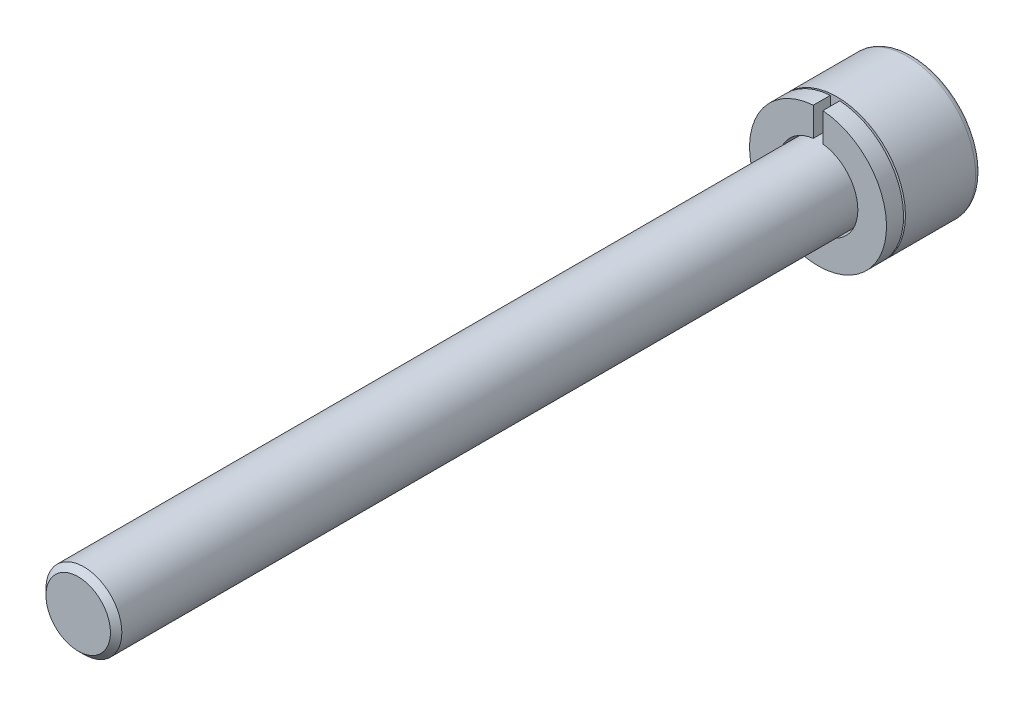
ISO-10303-21;
HEADER;
FILE_DESCRIPTION(('STEP AP214'),'2;1');
FILE_NAME('part.step','',(''),(''),'','','');
FILE_SCHEMA(('AUTOMOTIVE_DESIGN { 1 0 10303 214 1 1 1 1 }'));
ENDSEC;
DATA;
#1=APPLICATION_CONTEXT('core data for automotive mechanical design processes');
#2=APPLICATION_PROTOCOL_DEFINITION('international standard','automotive_design',2000,#1);
#3=PRODUCT_CONTEXT('',#1,'mechanical');
#4=PRODUCT('Part','Part','',(#3));
#5=PRODUCT_RELATED_PRODUCT_CATEGORY('part','',(#4));
#6=PRODUCT_DEFINITION_FORMATION('','',#4);
#7=PRODUCT_DEFINITION_CONTEXT('part definition',#1,'design');
#8=PRODUCT_DEFINITION('design','',#6,#7);
#9=PRODUCT_DEFINITION_SHAPE('','',#8);
#10=(LENGTH_UNIT() NAMED_UNIT(*) SI_UNIT(.MILLI.,.METRE.));
#11=(NAMED_UNIT(*) PLANE_ANGLE_UNIT() SI_UNIT($,.RADIAN.));
#12=(NAMED_UNIT(*) SI_UNIT($,.STERADIAN.) SOLID_ANGLE_UNIT());
#13=UNCERTAINTY_MEASURE_WITH_UNIT(LENGTH_MEASURE(1.E-05),#10,'distance_accuracy_value','');
#14=(GEOMETRIC_REPRESENTATION_CONTEXT(3) GLOBAL_UNCERTAINTY_ASSIGNED_CONTEXT((#13)) GLOBAL_UNIT_ASSIGNED_CONTEXT((#10,
#11,#12)) REPRESENTATION_CONTEXT('',''));
#15=CARTESIAN_POINT('',(0.,0.,0.));
#16=DIRECTION('',(0.,0.,1.));
#17=DIRECTION('',(1.,0.,0.));
#18=AXIS2_PLACEMENT_3D('',#15,#16,#17);
#19=CARTESIAN_POINT('',(0.,0.,4.));
#20=DIRECTION('',(0.,0.,1.));
#21=DIRECTION('',(1.,0.,0.));
#22=AXIS2_PLACEMENT_3D('',#19,#20,#21);
#23=PLANE('',#22);
#24=CARTESIAN_POINT('',(0.,0.,4.));
#25=DIRECTION('',(0.,0.,1.));
#26=DIRECTION('',(1.,0.,0.));
#27=AXIS2_PLACEMENT_3D('',#24,#25,#26);
#28=CIRCLE('',#27,3.61);
#29=CARTESIAN_POINT('',(3.61,0.,4.));
#30=VERTEX_POINT('',#29);
#31=EDGE_CURVE('P0_E126',#30,#30,#28,.T.);
#32=ORIENTED_EDGE('',*,*,#31,.T.);
#33=EDGE_LOOP('',(#32));
#34=FACE_BOUND('',#33,.T.);
#35=CARTESIAN_POINT('',(0.,0.,4.));
#36=DIRECTION('',(0.,0.,1.));
#37=DIRECTION('',(1.,0.,0.));
#38=AXIS2_PLACEMENT_3D('',#35,#36,#37);
#39=CIRCLE('',#38,2.);
#40=CARTESIAN_POINT('',(2.,0.,4.));
#41=VERTEX_POINT('',#40);
#42=EDGE_CURVE('P0_E118',#41,#41,#39,.T.);
#43=ORIENTED_EDGE('',*,*,#42,.F.);
#44=EDGE_LOOP('',(#43));
#45=FACE_BOUND('',#44,.T.);
#46=ADVANCED_FACE('P0_F17',(#34,#45),#23,.T.);
#47=CARTESIAN_POINT('',(0.,0.,4.));
#48=DIRECTION('',(0.,0.,-1.));
#49=DIRECTION('',(-1.,0.,0.));
#50=AXIS2_PLACEMENT_3D('',#47,#48,#49);
#51=CYLINDRICAL_SURFACE('',#50,3.61);
#52=CARTESIAN_POINT('',(0.,0.,0.3));
#53=DIRECTION('',(0.,0.,1.));
#54=DIRECTION('',(1.,0.,0.));
#55=AXIS2_PLACEMENT_3D('',#52,#53,#54);
#56=CIRCLE('',#55,3.61);
#57=CARTESIAN_POINT('',(3.61,0.,0.3));
#58=VERTEX_POINT('',#57);
#59=EDGE_CURVE('P0_E25',#58,#58,#56,.T.);
#60=ORIENTED_EDGE('',*,*,#59,.T.);
#61=EDGE_LOOP('',(#60));
#62=FACE_BOUND('',#61,.T.);
#63=ORIENTED_EDGE('',*,*,#31,.F.);
#64=EDGE_LOOP('',(#63));
#65=FACE_BOUND('',#64,.T.);
#66=ADVANCED_FACE('P0_F139',(#62,#65),#51,.T.);
#67=CARTESIAN_POINT('',(0.,0.,0.));
#68=DIRECTION('',(0.,0.,1.));
#69=DIRECTION('',(1.,0.,0.));
#70=AXIS2_PLACEMENT_3D('',#67,#68,#69);
#71=PLANE('',#70);
#72=CARTESIAN_POINT('',(0.,0.,0.));
#73=DIRECTION('',(0.,0.,1.));
#74=DIRECTION('',(1.,0.,0.));
#75=AXIS2_PLACEMENT_3D('',#72,#73,#74);
#76=CIRCLE('',#75,3.31);
#77=CARTESIAN_POINT('',(3.31,0.,0.));
#78=VERTEX_POINT('',#77);
#79=EDGE_CURVE('P0_E11',#78,#78,#76,.F.);
#80=ORIENTED_EDGE('',*,*,#79,.T.);
#81=EDGE_LOOP('',(#80));
#82=FACE_BOUND('',#81,.T.);
#83=DIRECTION('',(0.866025403784439,-0.5,0.));
#84=VECTOR('',#83,1.);
#85=CARTESIAN_POINT('',(0.,1.5,0.));
#86=LINE('',#85,#84);
#87=CARTESIAN_POINT('',(0.,1.5,0.));
#88=VERTEX_POINT('',#87);
#89=CARTESIAN_POINT('',(1.29903810567666,0.75,0.));
#90=VERTEX_POINT('',#89);
#91=EDGE_CURVE('P0_E106',#88,#90,#86,.T.);
#92=ORIENTED_EDGE('',*,*,#91,.F.);
#93=DIRECTION('',(0.866025403784439,0.5,0.));
#94=VECTOR('',#93,1.);
#95=CARTESIAN_POINT('',(-1.29903810567666,0.75,0.));
#96=LINE('',#95,#94);
#97=CARTESIAN_POINT('',(-1.29903810567666,0.75,0.));
#98=VERTEX_POINT('',#97);
#99=EDGE_CURVE('P0_E32',#98,#88,#96,.T.);
#100=ORIENTED_EDGE('',*,*,#99,.F.);
#101=DIRECTION('',(0.,1.,0.));
#102=VECTOR('',#101,1.);
#103=CARTESIAN_POINT('',(-1.29903810567666,-0.75,0.));
#104=LINE('',#103,#102);
#105=CARTESIAN_POINT('',(-1.29903810567666,-0.75,0.));
#106=VERTEX_POINT('',#105);
#107=EDGE_CURVE('P0_E113',#106,#98,#104,.T.);
#108=ORIENTED_EDGE('',*,*,#107,.F.);
#109=DIRECTION('',(-0.866025403784439,0.5,0.));
#110=VECTOR('',#109,1.);
#111=CARTESIAN_POINT('',(0.,-1.5,0.));
#112=LINE('',#111,#110);
#113=CARTESIAN_POINT('',(0.,-1.5,0.));
#114=VERTEX_POINT('',#113);
#115=EDGE_CURVE('P0_E114',#114,#106,#112,.T.);
#116=ORIENTED_EDGE('',*,*,#115,.F.);
#117=DIRECTION('',(-0.866025403784439,-0.5,0.));
#118=VECTOR('',#117,1.);
#119=CARTESIAN_POINT('',(1.29903810567666,-0.75,0.));
#120=LINE('',#119,#118);
#121=CARTESIAN_POINT('',(1.29903810567666,-0.75,0.));
#122=VERTEX_POINT('',#121);
#123=EDGE_CURVE('P0_E79',#122,#114,#120,.T.);
#124=ORIENTED_EDGE('',*,*,#123,.F.);
#125=DIRECTION('',(0.,-1.,0.));
#126=VECTOR('',#125,1.);
#127=CARTESIAN_POINT('',(1.29903810567666,0.75,0.));
#128=LINE('',#127,#126);
#129=EDGE_CURVE('P0_E108',#90,#122,#128,.T.);
#130=ORIENTED_EDGE('',*,*,#129,.F.);
#131=EDGE_LOOP('',(#92,#100,#108,#116,#124,#130));
#132=FACE_BOUND('',#131,.T.);
#133=ADVANCED_FACE('P0_F158',(#82,#132),#71,.F.);
#134=CARTESIAN_POINT('',(0.,0.,44.));
#135=DIRECTION('',(0.,0.,-1.));
#136=DIRECTION('',(-1.,0.,0.));
#137=AXIS2_PLACEMENT_3D('',#134,#135,#136);
#138=CYLINDRICAL_SURFACE('',#137,2.);
#139=CARTESIAN_POINT('',(0.,0.,43.7));
#140=DIRECTION('',(0.,0.,1.));
#141=DIRECTION('',(1.,0.,0.));
#142=AXIS2_PLACEMENT_3D('',#139,#140,#141);
#143=CIRCLE('',#142,2.);
#144=CARTESIAN_POINT('',(2.,0.,43.7));
#145=VERTEX_POINT('',#144);
#146=EDGE_CURVE('P0_E132',#145,#145,#143,.F.);
#147=ORIENTED_EDGE('',*,*,#146,.T.);
#148=EDGE_LOOP('',(#147));
#149=FACE_BOUND('',#148,.T.);
#150=ORIENTED_EDGE('',*,*,#42,.T.);
#151=EDGE_LOOP('',(#150));
#152=FACE_BOUND('',#151,.T.);
#153=ADVANCED_FACE('P0_F162',(#149,#152),#138,.T.);
#154=CARTESIAN_POINT('',(0.,0.,44.));
#155=DIRECTION('',(0.,0.,1.));
#156=DIRECTION('',(1.,0.,0.));
#157=AXIS2_PLACEMENT_3D('',#154,#155,#156);
#158=PLANE('',#157);
#159=CARTESIAN_POINT('',(0.,0.,44.));
#160=DIRECTION('',(0.,0.,1.));
#161=DIRECTION('',(1.,0.,0.));
#162=AXIS2_PLACEMENT_3D('',#159,#160,#161);
#163=CIRCLE('',#162,1.7);
#164=CARTESIAN_POINT('',(1.7,0.,44.));
#165=VERTEX_POINT('',#164);
#166=EDGE_CURVE('P0_E129',#165,#165,#163,.T.);
#167=ORIENTED_EDGE('',*,*,#166,.T.);
#168=EDGE_LOOP('',(#167));
#169=FACE_BOUND('',#168,.T.);
#170=ADVANCED_FACE('P0_F168',(#169),#158,.T.);
#171=CARTESIAN_POINT('',(0.,0.,44.));
#172=DIRECTION('',(0.,0.,-1.));
#173=DIRECTION('',(-1.,0.,0.));
#174=AXIS2_PLACEMENT_3D('',#171,#172,#173);
#175=CONICAL_SURFACE('',#174,1.7,0.785398163397446);
#176=ORIENTED_EDGE('',*,*,#146,.F.);
#177=EDGE_LOOP('',(#176));
#178=FACE_BOUND('',#177,.T.);
#179=ORIENTED_EDGE('',*,*,#166,.F.);
#180=EDGE_LOOP('',(#179));
#181=FACE_BOUND('',#180,.T.);
#182=ADVANCED_FACE('P0_F170',(#178,#181),#175,.T.);
#183=CARTESIAN_POINT('',(-1.29903810567666,0.75,1.8));
#184=DIRECTION('',(-0.5,0.866025403784439,0.));
#185=DIRECTION('',(-0.866025403784439,-0.5,0.));
#186=AXIS2_PLACEMENT_3D('',#183,#184,#185);
#187=PLANE('',#186);
#188=ORIENTED_EDGE('',*,*,#99,.T.);
#189=DIRECTION('',(0.,0.,-1.));
#190=VECTOR('',#189,1.);
#191=CARTESIAN_POINT('',(0.,1.5,1.8));
#192=LINE('',#191,#190);
#193=CARTESIAN_POINT('',(0.,1.5,1.8));
#194=VERTEX_POINT('',#193);
#195=EDGE_CURVE('P0_E62',#194,#88,#192,.T.);
#196=ORIENTED_EDGE('',*,*,#195,.F.);
#197=DIRECTION('',(0.866025403784439,0.5,0.));
#198=VECTOR('',#197,1.);
#199=CARTESIAN_POINT('',(-1.29903810567666,0.75,1.8));
#200=LINE('',#199,#198);
#201=CARTESIAN_POINT('',(-1.29903810567666,0.75,1.8));
#202=VERTEX_POINT('',#201);
#203=EDGE_CURVE('P0_E117',#202,#194,#200,.T.);
#204=ORIENTED_EDGE('',*,*,#203,.F.);
#205=DIRECTION('',(0.,0.,-1.));
#206=VECTOR('',#205,1.);
#207=CARTESIAN_POINT('',(-1.29903810567666,0.75,1.8));
#208=LINE('',#207,#206);
#209=EDGE_CURVE('P0_E37',#202,#98,#208,.T.);
#210=ORIENTED_EDGE('',*,*,#209,.T.);
#211=EDGE_LOOP('',(#188,#196,#204,#210));
#212=FACE_BOUND('',#211,.T.);
#213=ADVANCED_FACE('P0_F166',(#212),#187,.F.);
#214=CARTESIAN_POINT('',(-1.29903810567666,-0.75,1.8));
#215=DIRECTION('',(-1.,0.,0.));
#216=DIRECTION('',(0.,-1.,0.));
#217=AXIS2_PLACEMENT_3D('',#214,#215,#216);
#218=PLANE('',#217);
#219=ORIENTED_EDGE('',*,*,#107,.T.);
#220=ORIENTED_EDGE('',*,*,#209,.F.);
#221=DIRECTION('',(0.,1.,0.));
#222=VECTOR('',#221,1.);
#223=CARTESIAN_POINT('',(-1.29903810567666,-0.75,1.8));
#224=LINE('',#223,#222);
#225=CARTESIAN_POINT('',(-1.29903810567666,-0.75,1.8));
#226=VERTEX_POINT('',#225);
#227=EDGE_CURVE('P0_E95',#226,#202,#224,.T.);
#228=ORIENTED_EDGE('',*,*,#227,.F.);
#229=DIRECTION('',(0.,0.,-1.));
#230=VECTOR('',#229,1.);
#231=CARTESIAN_POINT('',(-1.29903810567666,-0.75,1.8));
#232=LINE('',#231,#230);
#233=EDGE_CURVE('P0_E81',#226,#106,#232,.T.);
#234=ORIENTED_EDGE('',*,*,#233,.T.);
#235=EDGE_LOOP('',(#219,#220,#228,#234));
#236=FACE_BOUND('',#235,.T.);
#237=ADVANCED_FACE('P0_F179',(#236),#218,.F.);
#238=CARTESIAN_POINT('',(0.,-1.5,1.8));
#239=DIRECTION('',(-0.5,-0.866025403784439,0.));
#240=DIRECTION('',(0.866025403784439,-0.5,0.));
#241=AXIS2_PLACEMENT_3D('',#238,#239,#240);
#242=PLANE('',#241);
#243=ORIENTED_EDGE('',*,*,#115,.T.);
#244=ORIENTED_EDGE('',*,*,#233,.F.);
#245=DIRECTION('',(-0.866025403784439,0.5,0.));
#246=VECTOR('',#245,1.);
#247=CARTESIAN_POINT('',(0.,-1.5,1.8));
#248=LINE('',#247,#246);
#249=CARTESIAN_POINT('',(0.,-1.5,1.8));
#250=VERTEX_POINT('',#249);
#251=EDGE_CURVE('P0_E86',#250,#226,#248,.T.);
#252=ORIENTED_EDGE('',*,*,#251,.F.);
#253=DIRECTION('',(0.,0.,-1.));
#254=VECTOR('',#253,1.);
#255=CARTESIAN_POINT('',(0.,-1.5,1.8));
#256=LINE('',#255,#254);
#257=EDGE_CURVE('P0_E73',#250,#114,#256,.T.);
#258=ORIENTED_EDGE('',*,*,#257,.T.);
#259=EDGE_LOOP('',(#243,#244,#252,#258));
#260=FACE_BOUND('',#259,.T.);
#261=ADVANCED_FACE('P0_F90',(#260),#242,.F.);
#262=CARTESIAN_POINT('',(1.29903810567666,-0.75,1.8));
#263=DIRECTION('',(0.5,-0.866025403784439,0.));
#264=DIRECTION('',(0.866025403784439,0.5,0.));
#265=AXIS2_PLACEMENT_3D('',#262,#263,#264);
#266=PLANE('',#265);
#267=ORIENTED_EDGE('',*,*,#123,.T.);
#268=ORIENTED_EDGE('',*,*,#257,.F.);
#269=DIRECTION('',(-0.866025403784439,-0.5,0.));
#270=VECTOR('',#269,1.);
#271=CARTESIAN_POINT('',(1.29903810567666,-0.75,1.8));
#272=LINE('',#271,#270);
#273=CARTESIAN_POINT('',(1.29903810567666,-0.75,1.8));
#274=VERTEX_POINT('',#273);
#275=EDGE_CURVE('P0_E80',#274,#250,#272,.T.);
#276=ORIENTED_EDGE('',*,*,#275,.F.);
#277=DIRECTION('',(0.,0.,-1.));
#278=VECTOR('',#277,1.);
#279=CARTESIAN_POINT('',(1.29903810567666,-0.75,1.8));
#280=LINE('',#279,#278);
#281=EDGE_CURVE('P0_E83',#274,#122,#280,.T.);
#282=ORIENTED_EDGE('',*,*,#281,.T.);
#283=EDGE_LOOP('',(#267,#268,#276,#282));
#284=FACE_BOUND('',#283,.T.);
#285=ADVANCED_FACE('P0_F74',(#284),#266,.F.);
#286=CARTESIAN_POINT('',(1.29903810567666,0.75,1.8));
#287=DIRECTION('',(1.,0.,0.));
#288=DIRECTION('',(0.,1.,0.));
#289=AXIS2_PLACEMENT_3D('',#286,#287,#288);
#290=PLANE('',#289);
#291=ORIENTED_EDGE('',*,*,#129,.T.);
#292=ORIENTED_EDGE('',*,*,#281,.F.);
#293=DIRECTION('',(0.,-1.,0.));
#294=VECTOR('',#293,1.);
#295=CARTESIAN_POINT('',(1.29903810567666,0.75,1.8));
#296=LINE('',#295,#294);
#297=CARTESIAN_POINT('',(1.29903810567666,0.75,1.8));
#298=VERTEX_POINT('',#297);
#299=EDGE_CURVE('P0_E98',#298,#274,#296,.T.);
#300=ORIENTED_EDGE('',*,*,#299,.F.);
#301=DIRECTION('',(0.,0.,-1.));
#302=VECTOR('',#301,1.);
#303=CARTESIAN_POINT('',(1.29903810567666,0.75,1.8));
#304=LINE('',#303,#302);
#305=EDGE_CURVE('P0_E124',#298,#90,#304,.T.);
#306=ORIENTED_EDGE('',*,*,#305,.T.);
#307=EDGE_LOOP('',(#291,#292,#300,#306));
#308=FACE_BOUND('',#307,.T.);
#309=ADVANCED_FACE('P0_F284',(#308),#290,.F.);
#310=CARTESIAN_POINT('',(0.,1.5,1.8));
#311=DIRECTION('',(0.5,0.866025403784439,0.));
#312=DIRECTION('',(-0.866025403784439,0.5,0.));
#313=AXIS2_PLACEMENT_3D('',#310,#311,#312);
#314=PLANE('',#313);
#315=ORIENTED_EDGE('',*,*,#91,.T.);
#316=ORIENTED_EDGE('',*,*,#305,.F.);
#317=DIRECTION('',(0.866025403784439,-0.5,0.));
#318=VECTOR('',#317,1.);
#319=CARTESIAN_POINT('',(0.,1.5,1.8));
#320=LINE('',#319,#318);
#321=EDGE_CURVE('P0_E99',#194,#298,#320,.T.);
#322=ORIENTED_EDGE('',*,*,#321,.F.);
#323=ORIENTED_EDGE('',*,*,#195,.T.);
#324=EDGE_LOOP('',(#315,#316,#322,#323));
#325=FACE_BOUND('',#324,.T.);
#326=ADVANCED_FACE('P0_F146',(#325),#314,.F.);
#327=CARTESIAN_POINT('',(0.,0.,1.8));
#328=DIRECTION('',(0.,0.,-1.));
#329=DIRECTION('',(-1.,0.,0.));
#330=AXIS2_PLACEMENT_3D('',#327,#328,#329);
#331=PLANE('',#330);
#332=ORIENTED_EDGE('',*,*,#203,.T.);
#333=ORIENTED_EDGE('',*,*,#321,.T.);
#334=ORIENTED_EDGE('',*,*,#299,.T.);
#335=ORIENTED_EDGE('',*,*,#275,.T.);
#336=ORIENTED_EDGE('',*,*,#251,.T.);
#337=ORIENTED_EDGE('',*,*,#227,.T.);
#338=EDGE_LOOP('',(#332,#333,#334,#335,#336,#337));
#339=FACE_BOUND('',#338,.T.);
#340=ADVANCED_FACE('P0_F92',(#339),#331,.T.);
#341=CARTESIAN_POINT('',(0.,0.,0.3));
#342=DIRECTION('',(0.,0.,1.));
#343=DIRECTION('',(1.,0.,0.));
#344=AXIS2_PLACEMENT_3D('',#341,#342,#343);
#345=TOROIDAL_SURFACE('',#344,3.31,0.3);
#346=ORIENTED_EDGE('',*,*,#79,.F.);
#347=EDGE_LOOP('',(#346));
#348=FACE_BOUND('',#347,.T.);
#349=ORIENTED_EDGE('',*,*,#59,.F.);
#350=EDGE_LOOP('',(#349));
#351=FACE_BOUND('',#350,.T.);
#352=ADVANCED_FACE('P0_F19',(#348,#351),#345,.T.);
#353=CLOSED_SHELL('',(#46,#66,#133,#153,#170,#182,#213,#237,#261,#285,#309,#326,#340,#352));
#354=MANIFOLD_SOLID_BREP('P0_B1',#353);
#355=CARTESIAN_POINT('',(0.,0.,5.));
#356=DIRECTION('',(0.,0.,1.));
#357=DIRECTION('',(1.,0.,0.));
#358=AXIS2_PLACEMENT_3D('',#355,#356,#357);
#359=PLANE('',#358);
#360=DIRECTION('',(0.,1.,0.));
#361=VECTOR('',#360,1.);
#362=CARTESIAN_POINT('',(0.25,5.1349340538007,5.));
#363=LINE('',#362,#361);
#364=CARTESIAN_POINT('',(0.25,2.0850659461993,5.));
#365=VERTEX_POINT('',#364);
#366=CARTESIAN_POINT('',(0.25,3.60133308651116,5.));
#367=VERTEX_POINT('',#366);
#368=EDGE_CURVE('P1_E71',#365,#367,#363,.T.);
#369=ORIENTED_EDGE('',*,*,#368,.F.);
#370=CARTESIAN_POINT('',(0.,0.,5.));
#371=DIRECTION('',(0.,0.,1.));
#372=DIRECTION('',(1.,0.,0.));
#373=AXIS2_PLACEMENT_3D('',#370,#371,#372);
#374=CIRCLE('',#373,2.1);
#375=CARTESIAN_POINT('',(-0.25,2.0850659461993,5.));
#376=VERTEX_POINT('',#375);
#377=EDGE_CURVE('P1_E72',#376,#365,#374,.T.);
#378=ORIENTED_EDGE('',*,*,#377,.F.);
#379=DIRECTION('',(0.,-1.,0.));
#380=VECTOR('',#379,1.);
#381=CARTESIAN_POINT('',(-0.25,5.1349340538007,5.));
#382=LINE('',#381,#380);
#383=CARTESIAN_POINT('',(-0.25,3.60133308651116,5.));
#384=VERTEX_POINT('',#383);
#385=EDGE_CURVE('P1_E83',#384,#376,#382,.T.);
#386=ORIENTED_EDGE('',*,*,#385,.F.);
#387=CARTESIAN_POINT('',(0.,0.,5.));
#388=DIRECTION('',(0.,0.,1.));
#389=DIRECTION('',(1.,0.,0.));
#390=AXIS2_PLACEMENT_3D('',#387,#388,#389);
#391=CIRCLE('',#390,3.61);
#392=EDGE_CURVE('P1_E25',#384,#367,#391,.T.);
#393=ORIENTED_EDGE('',*,*,#392,.T.);
#394=EDGE_LOOP('',(#369,#378,#386,#393));
#395=FACE_BOUND('',#394,.T.);
#396=ADVANCED_FACE('P1_F17',(#395),#359,.T.);
#397=CARTESIAN_POINT('',(0.,0.,5.));
#398=DIRECTION('',(0.,0.,-1.));
#399=DIRECTION('',(-1.,0.,0.));
#400=AXIS2_PLACEMENT_3D('',#397,#398,#399);
#401=CYLINDRICAL_SURFACE('',#400,3.61);
#402=DIRECTION('',(0.,0.,-1.));
#403=VECTOR('',#402,1.);
#404=CARTESIAN_POINT('',(-0.25,3.60133308651116,5.));
#405=LINE('',#404,#403);
#406=CARTESIAN_POINT('',(-0.25,3.60133308651116,4.1));
#407=VERTEX_POINT('',#406);
#408=EDGE_CURVE('P1_E70',#384,#407,#405,.T.);
#409=ORIENTED_EDGE('',*,*,#408,.T.);
#410=CARTESIAN_POINT('',(0.,0.,4.1));
#411=DIRECTION('',(0.,0.,1.));
#412=DIRECTION('',(1.,0.,0.));
#413=AXIS2_PLACEMENT_3D('',#410,#411,#412);
#414=CIRCLE('',#413,3.61);
#415=CARTESIAN_POINT('',(0.25,3.60133308651116,4.1));
#416=VERTEX_POINT('',#415);
#417=EDGE_CURVE('P1_E60',#407,#416,#414,.T.);
#418=ORIENTED_EDGE('',*,*,#417,.T.);
#419=DIRECTION('',(0.,0.,-1.));
#420=VECTOR('',#419,1.);
#421=CARTESIAN_POINT('',(0.25,3.60133308651116,5.));
#422=LINE('',#421,#420);
#423=EDGE_CURVE('P1_E65',#416,#367,#422,.F.);
#424=ORIENTED_EDGE('',*,*,#423,.T.);
#425=ORIENTED_EDGE('',*,*,#392,.F.);
#426=EDGE_LOOP('',(#409,#418,#424,#425));
#427=FACE_BOUND('',#426,.T.);
#428=ADVANCED_FACE('P1_F19',(#427),#401,.T.);
#429=CARTESIAN_POINT('',(0.,0.,5.));
#430=DIRECTION('',(0.,0.,-1.));
#431=DIRECTION('',(-1.,0.,0.));
#432=AXIS2_PLACEMENT_3D('',#429,#430,#431);
#433=CYLINDRICAL_SURFACE('',#432,2.1);
#434=CARTESIAN_POINT('',(0.,0.,4.1));
#435=DIRECTION('',(0.,0.,1.));
#436=DIRECTION('',(1.,0.,0.));
#437=AXIS2_PLACEMENT_3D('',#434,#435,#436);
#438=CIRCLE('',#437,2.1);
#439=CARTESIAN_POINT('',(-0.25,2.0850659461993,4.1));
#440=VERTEX_POINT('',#439);
#441=CARTESIAN_POINT('',(0.25,2.0850659461993,4.1));
#442=VERTEX_POINT('',#441);
#443=EDGE_CURVE('P1_E32',#440,#442,#438,.T.);
#444=ORIENTED_EDGE('',*,*,#443,.F.);
#445=DIRECTION('',(0.,0.,1.));
#446=VECTOR('',#445,1.);
#447=CARTESIAN_POINT('',(-0.25,2.0850659461993,4.));
#448=LINE('',#447,#446);
#449=EDGE_CURVE('P1_E36',#440,#376,#448,.T.);
#450=ORIENTED_EDGE('',*,*,#449,.T.);
#451=ORIENTED_EDGE('',*,*,#377,.T.);
#452=DIRECTION('',(0.,0.,1.));
#453=VECTOR('',#452,1.);
#454=CARTESIAN_POINT('',(0.25,2.0850659461993,4.));
#455=LINE('',#454,#453);
#456=EDGE_CURVE('P1_E80',#442,#365,#455,.T.);
#457=ORIENTED_EDGE('',*,*,#456,.F.);
#458=EDGE_LOOP('',(#444,#450,#451,#457));
#459=FACE_BOUND('',#458,.T.);
#460=ADVANCED_FACE('P1_F90',(#459),#433,.F.);
#461=CARTESIAN_POINT('',(-0.25,5.1349340538007,4.));
#462=DIRECTION('',(-1.,0.,0.));
#463=DIRECTION('',(0.,0.,1.));
#464=AXIS2_PLACEMENT_3D('',#461,#462,#463);
#465=PLANE('',#464);
#466=ORIENTED_EDGE('',*,*,#449,.F.);
#467=DIRECTION('',(0.,1.,0.));
#468=VECTOR('',#467,1.);
#469=CARTESIAN_POINT('',(-0.25,5.1349340538007,4.1));
#470=LINE('',#469,#468);
#471=EDGE_CURVE('P1_E69',#440,#407,#470,.T.);
#472=ORIENTED_EDGE('',*,*,#471,.T.);
#473=ORIENTED_EDGE('',*,*,#408,.F.);
#474=ORIENTED_EDGE('',*,*,#385,.T.);
#475=EDGE_LOOP('',(#466,#472,#473,#474));
#476=FACE_BOUND('',#475,.T.);
#477=ADVANCED_FACE('P1_F93',(#476),#465,.F.);
#478=CARTESIAN_POINT('',(0.25,5.1349340538007,4.));
#479=DIRECTION('',(1.,0.,0.));
#480=DIRECTION('',(0.,0.,-1.));
#481=AXIS2_PLACEMENT_3D('',#478,#479,#480);
#482=PLANE('',#481);
#483=ORIENTED_EDGE('',*,*,#423,.F.);
#484=DIRECTION('',(0.,-1.,0.));
#485=VECTOR('',#484,1.);
#486=CARTESIAN_POINT('',(0.25,5.1349340538007,4.1));
#487=LINE('',#486,#485);
#488=EDGE_CURVE('P1_E11',#416,#442,#487,.T.);
#489=ORIENTED_EDGE('',*,*,#488,.T.);
#490=ORIENTED_EDGE('',*,*,#456,.T.);
#491=ORIENTED_EDGE('',*,*,#368,.T.);
#492=EDGE_LOOP('',(#483,#489,#490,#491));
#493=FACE_BOUND('',#492,.T.);
#494=ADVANCED_FACE('P1_F68',(#493),#482,.F.);
#495=CARTESIAN_POINT('',(0.,0.,4.1));
#496=DIRECTION('',(0.,0.,1.));
#497=DIRECTION('',(1.,0.,0.));
#498=AXIS2_PLACEMENT_3D('',#495,#496,#497);
#499=PLANE('',#498);
#500=ORIENTED_EDGE('',*,*,#443,.T.);
#501=ORIENTED_EDGE('',*,*,#488,.F.);
#502=ORIENTED_EDGE('',*,*,#417,.F.);
#503=ORIENTED_EDGE('',*,*,#471,.F.);
#504=EDGE_LOOP('',(#500,#501,#502,#503));
#505=FACE_BOUND('',#504,.T.);
#506=ADVANCED_FACE('P1_F57',(#505),#499,.F.);
#507=CLOSED_SHELL('',(#396,#428,#460,#477,#494,#506));
#508=MANIFOLD_SOLID_BREP('P1_B1',#507);
#509=ADVANCED_BREP_SHAPE_REPRESENTATION('',(#18,#354,#508),#14);
#510=SHAPE_DEFINITION_REPRESENTATION(#9,#509);
ENDSEC;
END-ISO-10303-21;
